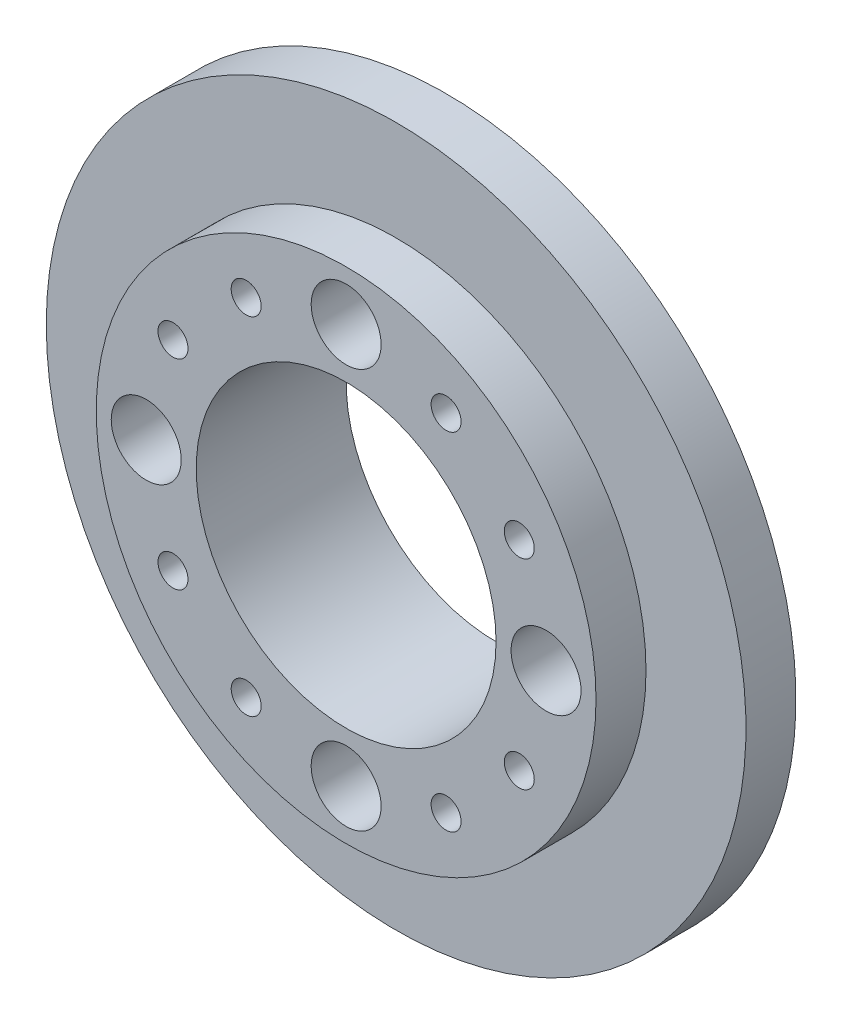
ISO-10303-21;
HEADER;
FILE_DESCRIPTION(('STEP AP214'),'2;1');
FILE_NAME('part.step','',(''),(''),'','','');
FILE_SCHEMA(('AUTOMOTIVE_DESIGN { 1 0 10303 214 1 1 1 1 }'));
ENDSEC;
DATA;
#1=APPLICATION_CONTEXT('core data for automotive mechanical design processes');
#2=APPLICATION_PROTOCOL_DEFINITION('international standard','automotive_design',2000,#1);
#3=PRODUCT_CONTEXT('',#1,'mechanical');
#4=PRODUCT('Part','Part','',(#3));
#5=PRODUCT_RELATED_PRODUCT_CATEGORY('part','',(#4));
#6=PRODUCT_DEFINITION_FORMATION('','',#4);
#7=PRODUCT_DEFINITION_CONTEXT('part definition',#1,'design');
#8=PRODUCT_DEFINITION('design','',#6,#7);
#9=PRODUCT_DEFINITION_SHAPE('','',#8);
#10=(LENGTH_UNIT() NAMED_UNIT(*) SI_UNIT(.MILLI.,.METRE.));
#11=(NAMED_UNIT(*) PLANE_ANGLE_UNIT() SI_UNIT($,.RADIAN.));
#12=(NAMED_UNIT(*) SI_UNIT($,.STERADIAN.) SOLID_ANGLE_UNIT());
#13=UNCERTAINTY_MEASURE_WITH_UNIT(LENGTH_MEASURE(1.E-05),#10,'distance_accuracy_value','');
#14=(GEOMETRIC_REPRESENTATION_CONTEXT(3) GLOBAL_UNCERTAINTY_ASSIGNED_CONTEXT((#13)) GLOBAL_UNIT_ASSIGNED_CONTEXT((#10,
#11,#12)) REPRESENTATION_CONTEXT('',''));
#15=CARTESIAN_POINT('',(0.,0.,0.));
#16=DIRECTION('',(0.,0.,1.));
#17=DIRECTION('',(1.,0.,0.));
#18=AXIS2_PLACEMENT_3D('',#15,#16,#17);
#19=CARTESIAN_POINT('',(0.,0.,2.5));
#20=DIRECTION('',(0.,0.,-1.));
#21=DIRECTION('',(-1.,0.,0.));
#22=AXIS2_PLACEMENT_3D('',#19,#20,#21);
#23=CYLINDRICAL_SURFACE('',#22,12.5);
#24=CARTESIAN_POINT('',(0.,0.,2.5));
#25=DIRECTION('',(0.,0.,1.));
#26=DIRECTION('',(1.,0.,0.));
#27=AXIS2_PLACEMENT_3D('',#24,#25,#26);
#28=CIRCLE('',#27,12.5);
#29=CARTESIAN_POINT('',(12.5,0.,2.5));
#30=VERTEX_POINT('',#29);
#31=EDGE_CURVE('E44',#30,#30,#28,.T.);
#32=ORIENTED_EDGE('',*,*,#31,.F.);
#33=EDGE_LOOP('',(#32));
#34=FACE_BOUND('',#33,.T.);
#35=CARTESIAN_POINT('',(0.,0.,0.));
#36=DIRECTION('',(0.,0.,1.));
#37=DIRECTION('',(1.,0.,0.));
#38=AXIS2_PLACEMENT_3D('',#35,#36,#37);
#39=CIRCLE('',#38,12.5);
#40=CARTESIAN_POINT('',(12.5,0.,0.));
#41=VERTEX_POINT('',#40);
#42=EDGE_CURVE('E39',#41,#41,#39,.T.);
#43=ORIENTED_EDGE('',*,*,#42,.T.);
#44=EDGE_LOOP('',(#43));
#45=FACE_BOUND('',#44,.T.);
#46=ADVANCED_FACE('F36',(#34,#45),#23,.T.);
#47=CARTESIAN_POINT('',(0.,0.,2.5));
#48=DIRECTION('',(0.,0.,1.));
#49=DIRECTION('',(1.,0.,0.));
#50=AXIS2_PLACEMENT_3D('',#47,#48,#49);
#51=PLANE('',#50);
#52=CARTESIAN_POINT('',(0.,10.,2.5));
#53=DIRECTION('',(0.,0.,1.));
#54=DIRECTION('',(1.,0.,0.));
#55=AXIS2_PLACEMENT_3D('',#52,#53,#54);
#56=CIRCLE('',#55,1.75);
#57=CARTESIAN_POINT('',(1.75,10.,2.5));
#58=VERTEX_POINT('',#57);
#59=EDGE_CURVE('E135',#58,#58,#56,.T.);
#60=ORIENTED_EDGE('',*,*,#59,.F.);
#61=EDGE_LOOP('',(#60));
#62=FACE_BOUND('',#61,.T.);
#63=CARTESIAN_POINT('',(-10.0000000000003,2.82380124105319E-13,2.5));
#64=DIRECTION('',(0.,0.,1.));
#65=DIRECTION('',(1.,0.,0.));
#66=AXIS2_PLACEMENT_3D('',#63,#64,#65);
#67=CIRCLE('',#66,1.75000000000022);
#68=CARTESIAN_POINT('',(-8.25000000000006,2.82380124105319E-13,2.5));
#69=VERTEX_POINT('',#68);
#70=EDGE_CURVE('E145',#69,#69,#67,.T.);
#71=ORIENTED_EDGE('',*,*,#70,.F.);
#72=EDGE_LOOP('',(#71));
#73=FACE_BOUND('',#72,.T.);
#74=CARTESIAN_POINT('',(-5.64760248210638E-13,-10.,2.5));
#75=DIRECTION('',(0.,0.,1.));
#76=DIRECTION('',(1.,0.,0.));
#77=AXIS2_PLACEMENT_3D('',#74,#75,#76);
#78=CIRCLE('',#77,1.75000000000061);
#79=CARTESIAN_POINT('',(1.75000000000004,-10.,2.5));
#80=VERTEX_POINT('',#79);
#81=EDGE_CURVE('E149',#80,#80,#78,.T.);
#82=ORIENTED_EDGE('',*,*,#81,.F.);
#83=EDGE_LOOP('',(#82));
#84=FACE_BOUND('',#83,.T.);
#85=CARTESIAN_POINT('',(9.99999999999972,-2.83604770904466E-13,2.5));
#86=DIRECTION('',(0.,0.,1.));
#87=DIRECTION('',(1.,0.,0.));
#88=AXIS2_PLACEMENT_3D('',#85,#86,#87);
#89=CIRCLE('',#88,1.75000000000045);
#90=CARTESIAN_POINT('',(11.7500000000002,-2.83604770904466E-13,2.5));
#91=VERTEX_POINT('',#90);
#92=EDGE_CURVE('E153',#91,#91,#89,.T.);
#93=ORIENTED_EDGE('',*,*,#92,.F.);
#94=EDGE_LOOP('',(#93));
#95=FACE_BOUND('',#94,.T.);
#96=CARTESIAN_POINT('',(-5.00000000000007,-8.66025403784435,2.5));
#97=DIRECTION('',(0.,0.,1.));
#98=DIRECTION('',(1.,0.,0.));
#99=AXIS2_PLACEMENT_3D('',#96,#97,#98);
#100=CIRCLE('',#99,0.75);
#101=CARTESIAN_POINT('',(-4.25000000000007,-8.66025403784435,2.5));
#102=VERTEX_POINT('',#101);
#103=EDGE_CURVE('E65',#102,#102,#100,.T.);
#104=ORIENTED_EDGE('',*,*,#103,.F.);
#105=EDGE_LOOP('',(#104));
#106=FACE_BOUND('',#105,.T.);
#107=CARTESIAN_POINT('',(4.99999999999995,-8.66025403784442,2.5));
#108=DIRECTION('',(0.,0.,1.));
#109=DIRECTION('',(1.,0.,0.));
#110=AXIS2_PLACEMENT_3D('',#107,#108,#109);
#111=CIRCLE('',#110,0.75);
#112=CARTESIAN_POINT('',(5.74999999999995,-8.66025403784442,2.5));
#113=VERTEX_POINT('',#112);
#114=EDGE_CURVE('E70',#113,#113,#111,.T.);
#115=ORIENTED_EDGE('',*,*,#114,.F.);
#116=EDGE_LOOP('',(#115));
#117=FACE_BOUND('',#116,.T.);
#118=CARTESIAN_POINT('',(8.66025403784437,-5.00000000000004,2.5));
#119=DIRECTION('',(0.,0.,1.));
#120=DIRECTION('',(1.,0.,0.));
#121=AXIS2_PLACEMENT_3D('',#118,#119,#120);
#122=CIRCLE('',#121,0.75);
#123=CARTESIAN_POINT('',(9.41025403784437,-5.00000000000004,2.5));
#124=VERTEX_POINT('',#123);
#125=EDGE_CURVE('E75',#124,#124,#122,.T.);
#126=ORIENTED_EDGE('',*,*,#125,.F.);
#127=EDGE_LOOP('',(#126));
#128=FACE_BOUND('',#127,.T.);
#129=CARTESIAN_POINT('',(8.6602540378444,4.99999999999998,2.5));
#130=DIRECTION('',(0.,0.,1.));
#131=DIRECTION('',(1.,0.,0.));
#132=AXIS2_PLACEMENT_3D('',#129,#130,#131);
#133=CIRCLE('',#132,0.75);
#134=CARTESIAN_POINT('',(9.4102540378444,4.99999999999998,2.5));
#135=VERTEX_POINT('',#134);
#136=EDGE_CURVE('E81',#135,#135,#133,.T.);
#137=ORIENTED_EDGE('',*,*,#136,.F.);
#138=EDGE_LOOP('',(#137));
#139=FACE_BOUND('',#138,.T.);
#140=CARTESIAN_POINT('',(5.00000000000001,8.66025403784438,2.5));
#141=DIRECTION('',(0.,0.,1.));
#142=DIRECTION('',(1.,0.,0.));
#143=AXIS2_PLACEMENT_3D('',#140,#141,#142);
#144=CIRCLE('',#143,0.75);
#145=CARTESIAN_POINT('',(5.75000000000001,8.66025403784438,2.5));
#146=VERTEX_POINT('',#145);
#147=EDGE_CURVE('E85',#146,#146,#144,.T.);
#148=ORIENTED_EDGE('',*,*,#147,.F.);
#149=EDGE_LOOP('',(#148));
#150=FACE_BOUND('',#149,.T.);
#151=CARTESIAN_POINT('',(0.,0.,2.5));
#152=DIRECTION('',(0.,0.,1.));
#153=DIRECTION('',(1.,0.,0.));
#154=AXIS2_PLACEMENT_3D('',#151,#152,#153);
#155=CIRCLE('',#154,7.5);
#156=CARTESIAN_POINT('',(7.5,0.,2.5));
#157=VERTEX_POINT('',#156);
#158=EDGE_CURVE('E89',#157,#157,#155,.T.);
#159=ORIENTED_EDGE('',*,*,#158,.F.);
#160=EDGE_LOOP('',(#159));
#161=FACE_BOUND('',#160,.T.);
#162=CARTESIAN_POINT('',(-8.66025403784443,-4.99999999999992,2.5));
#163=DIRECTION('',(0.,0.,1.));
#164=DIRECTION('',(1.,0.,0.));
#165=AXIS2_PLACEMENT_3D('',#162,#163,#164);
#166=CIRCLE('',#165,0.75);
#167=CARTESIAN_POINT('',(-7.91025403784443,-4.99999999999992,2.5));
#168=VERTEX_POINT('',#167);
#169=EDGE_CURVE('E93',#168,#168,#166,.T.);
#170=ORIENTED_EDGE('',*,*,#169,.F.);
#171=EDGE_LOOP('',(#170));
#172=FACE_BOUND('',#171,.T.);
#173=CARTESIAN_POINT('',(-8.66025403784433,5.0000000000001,2.5));
#174=DIRECTION('',(0.,0.,1.));
#175=DIRECTION('',(1.,0.,0.));
#176=AXIS2_PLACEMENT_3D('',#173,#174,#175);
#177=CIRCLE('',#176,0.750000000000001);
#178=CARTESIAN_POINT('',(-7.91025403784433,5.0000000000001,2.5));
#179=VERTEX_POINT('',#178);
#180=EDGE_CURVE('E97',#179,#179,#177,.T.);
#181=ORIENTED_EDGE('',*,*,#180,.F.);
#182=EDGE_LOOP('',(#181));
#183=FACE_BOUND('',#182,.T.);
#184=CARTESIAN_POINT('',(-4.99999999999989,8.66025403784445,2.5));
#185=DIRECTION('',(0.,0.,1.));
#186=DIRECTION('',(1.,0.,0.));
#187=AXIS2_PLACEMENT_3D('',#184,#185,#186);
#188=CIRCLE('',#187,0.749999999999999);
#189=CARTESIAN_POINT('',(-4.24999999999989,8.66025403784445,2.5));
#190=VERTEX_POINT('',#189);
#191=EDGE_CURVE('E101',#190,#190,#188,.T.);
#192=ORIENTED_EDGE('',*,*,#191,.F.);
#193=EDGE_LOOP('',(#192));
#194=FACE_BOUND('',#193,.T.);
#195=ORIENTED_EDGE('',*,*,#31,.T.);
#196=EDGE_LOOP('',(#195));
#197=FACE_BOUND('',#196,.T.);
#198=ADVANCED_FACE('F218',(#62,#73,#84,#95,#106,#117,#128,#139,#150,#161,#172,#183,#194,#197),
#51,.T.);
#199=CARTESIAN_POINT('',(0.,0.,-2.5));
#200=DIRECTION('',(0.,0.,1.));
#201=DIRECTION('',(1.,0.,0.));
#202=AXIS2_PLACEMENT_3D('',#199,#200,#201);
#203=CYLINDRICAL_SURFACE('',#202,17.5);
#204=CARTESIAN_POINT('',(0.,0.,-2.5));
#205=DIRECTION('',(0.,0.,-1.));
#206=DIRECTION('',(-1.,0.,0.));
#207=AXIS2_PLACEMENT_3D('',#204,#205,#206);
#208=CIRCLE('',#207,17.5);
#209=CARTESIAN_POINT('',(-17.5,0.,-2.5));
#210=VERTEX_POINT('',#209);
#211=EDGE_CURVE('E54',#210,#210,#208,.T.);
#212=ORIENTED_EDGE('',*,*,#211,.F.);
#213=EDGE_LOOP('',(#212));
#214=FACE_BOUND('',#213,.T.);
#215=CARTESIAN_POINT('',(0.,0.,0.));
#216=DIRECTION('',(0.,0.,-1.));
#217=DIRECTION('',(-1.,0.,0.));
#218=AXIS2_PLACEMENT_3D('',#215,#216,#217);
#219=CIRCLE('',#218,17.5);
#220=CARTESIAN_POINT('',(-17.5,0.,0.));
#221=VERTEX_POINT('',#220);
#222=EDGE_CURVE('E58',#221,#221,#219,.T.);
#223=ORIENTED_EDGE('',*,*,#222,.T.);
#224=EDGE_LOOP('',(#223));
#225=FACE_BOUND('',#224,.T.);
#226=ADVANCED_FACE('F223',(#214,#225),#203,.T.);
#227=CARTESIAN_POINT('',(0.,0.,-2.5));
#228=DIRECTION('',(0.,0.,-1.));
#229=DIRECTION('',(-1.,0.,0.));
#230=AXIS2_PLACEMENT_3D('',#227,#228,#229);
#231=PLANE('',#230);
#232=CARTESIAN_POINT('',(0.,0.,-2.5));
#233=DIRECTION('',(0.,0.,-1.));
#234=DIRECTION('',(-1.,0.,0.));
#235=AXIS2_PLACEMENT_3D('',#232,#233,#234);
#236=CIRCLE('',#235,12.5);
#237=CARTESIAN_POINT('',(-12.5,0.,-2.5));
#238=VERTEX_POINT('',#237);
#239=EDGE_CURVE('E10',#238,#238,#236,.T.);
#240=ORIENTED_EDGE('',*,*,#239,.F.);
#241=EDGE_LOOP('',(#240));
#242=FACE_BOUND('',#241,.T.);
#243=ORIENTED_EDGE('',*,*,#211,.T.);
#244=EDGE_LOOP('',(#243));
#245=FACE_BOUND('',#244,.T.);
#246=ADVANCED_FACE('F234',(#242,#245),#231,.T.);
#247=CARTESIAN_POINT('',(0.,0.,0.));
#248=DIRECTION('',(0.,0.,-1.));
#249=DIRECTION('',(-1.,0.,0.));
#250=AXIS2_PLACEMENT_3D('',#247,#248,#249);
#251=PLANE('',#250);
#252=ORIENTED_EDGE('',*,*,#42,.F.);
#253=EDGE_LOOP('',(#252));
#254=FACE_BOUND('',#253,.T.);
#255=ORIENTED_EDGE('',*,*,#222,.F.);
#256=EDGE_LOOP('',(#255));
#257=FACE_BOUND('',#256,.T.);
#258=ADVANCED_FACE('F231',(#254,#257),#251,.F.);
#259=CARTESIAN_POINT('',(0.,0.,-5.));
#260=DIRECTION('',(0.,0.,1.));
#261=DIRECTION('',(1.,0.,0.));
#262=AXIS2_PLACEMENT_3D('',#259,#260,#261);
#263=CYLINDRICAL_SURFACE('',#262,12.5);
#264=CARTESIAN_POINT('',(0.,0.,-5.));
#265=DIRECTION('',(0.,0.,-1.));
#266=DIRECTION('',(-1.,0.,0.));
#267=AXIS2_PLACEMENT_3D('',#264,#265,#266);
#268=CIRCLE('',#267,12.5);
#269=CARTESIAN_POINT('',(-12.5,0.,-5.));
#270=VERTEX_POINT('',#269);
#271=EDGE_CURVE('E52',#270,#270,#268,.T.);
#272=ORIENTED_EDGE('',*,*,#271,.F.);
#273=EDGE_LOOP('',(#272));
#274=FACE_BOUND('',#273,.T.);
#275=ORIENTED_EDGE('',*,*,#239,.T.);
#276=EDGE_LOOP('',(#275));
#277=FACE_BOUND('',#276,.T.);
#278=ADVANCED_FACE('F180',(#274,#277),#263,.T.);
#279=CARTESIAN_POINT('',(0.,0.,-5.));
#280=DIRECTION('',(0.,0.,-1.));
#281=DIRECTION('',(-1.,0.,0.));
#282=AXIS2_PLACEMENT_3D('',#279,#280,#281);
#283=PLANE('',#282);
#284=CARTESIAN_POINT('',(0.,10.,-5.));
#285=DIRECTION('',(0.,0.,-1.));
#286=DIRECTION('',(-1.,0.,0.));
#287=AXIS2_PLACEMENT_3D('',#284,#285,#286);
#288=CIRCLE('',#287,1.75);
#289=CARTESIAN_POINT('',(-1.75,10.,-5.));
#290=VERTEX_POINT('',#289);
#291=EDGE_CURVE('E157',#290,#290,#288,.T.);
#292=ORIENTED_EDGE('',*,*,#291,.F.);
#293=EDGE_LOOP('',(#292));
#294=FACE_BOUND('',#293,.T.);
#295=CARTESIAN_POINT('',(-10.0000000000003,2.82380124105319E-13,-5.));
#296=DIRECTION('',(0.,0.,-1.));
#297=DIRECTION('',(-1.,0.,0.));
#298=AXIS2_PLACEMENT_3D('',#295,#296,#297);
#299=CIRCLE('',#298,1.75000000000022);
#300=CARTESIAN_POINT('',(-11.7500000000005,2.82380124105319E-13,-5.));
#301=VERTEX_POINT('',#300);
#302=EDGE_CURVE('E166',#301,#301,#299,.T.);
#303=ORIENTED_EDGE('',*,*,#302,.F.);
#304=EDGE_LOOP('',(#303));
#305=FACE_BOUND('',#304,.T.);
#306=CARTESIAN_POINT('',(-5.64760248210638E-13,-10.,-5.));
#307=DIRECTION('',(0.,0.,-1.));
#308=DIRECTION('',(-1.,0.,0.));
#309=AXIS2_PLACEMENT_3D('',#306,#307,#308);
#310=CIRCLE('',#309,1.75000000000061);
#311=CARTESIAN_POINT('',(-1.75000000000117,-10.,-5.));
#312=VERTEX_POINT('',#311);
#313=EDGE_CURVE('E162',#312,#312,#310,.T.);
#314=ORIENTED_EDGE('',*,*,#313,.F.);
#315=EDGE_LOOP('',(#314));
#316=FACE_BOUND('',#315,.T.);
#317=CARTESIAN_POINT('',(9.99999999999972,-2.83604770904466E-13,-5.));
#318=DIRECTION('',(0.,0.,-1.));
#319=DIRECTION('',(-1.,0.,0.));
#320=AXIS2_PLACEMENT_3D('',#317,#318,#319);
#321=CIRCLE('',#320,1.75000000000045);
#322=CARTESIAN_POINT('',(8.24999999999927,-2.83604770904466E-13,-5.));
#323=VERTEX_POINT('',#322);
#324=EDGE_CURVE('E158',#323,#323,#321,.T.);
#325=ORIENTED_EDGE('',*,*,#324,.F.);
#326=EDGE_LOOP('',(#325));
#327=FACE_BOUND('',#326,.T.);
#328=CARTESIAN_POINT('',(-5.00000000000007,-8.66025403784435,-5.));
#329=DIRECTION('',(0.,0.,1.));
#330=DIRECTION('',(1.,0.,0.));
#331=AXIS2_PLACEMENT_3D('',#328,#329,#330);
#332=CIRCLE('',#331,0.75);
#333=CARTESIAN_POINT('',(-4.25000000000007,-8.66025403784435,-5.));
#334=VERTEX_POINT('',#333);
#335=EDGE_CURVE('E118',#334,#334,#332,.T.);
#336=ORIENTED_EDGE('',*,*,#335,.T.);
#337=EDGE_LOOP('',(#336));
#338=FACE_BOUND('',#337,.T.);
#339=CARTESIAN_POINT('',(4.99999999999995,-8.66025403784442,-5.));
#340=DIRECTION('',(0.,0.,1.));
#341=DIRECTION('',(1.,0.,0.));
#342=AXIS2_PLACEMENT_3D('',#339,#340,#341);
#343=CIRCLE('',#342,0.75);
#344=CARTESIAN_POINT('',(5.74999999999995,-8.66025403784442,-5.));
#345=VERTEX_POINT('',#344);
#346=EDGE_CURVE('E122',#345,#345,#343,.T.);
#347=ORIENTED_EDGE('',*,*,#346,.T.);
#348=EDGE_LOOP('',(#347));
#349=FACE_BOUND('',#348,.T.);
#350=CARTESIAN_POINT('',(8.66025403784437,-5.00000000000004,-5.));
#351=DIRECTION('',(0.,0.,1.));
#352=DIRECTION('',(1.,0.,0.));
#353=AXIS2_PLACEMENT_3D('',#350,#351,#352);
#354=CIRCLE('',#353,0.75);
#355=CARTESIAN_POINT('',(9.41025403784437,-5.00000000000004,-5.));
#356=VERTEX_POINT('',#355);
#357=EDGE_CURVE('E111',#356,#356,#354,.T.);
#358=ORIENTED_EDGE('',*,*,#357,.T.);
#359=EDGE_LOOP('',(#358));
#360=FACE_BOUND('',#359,.T.);
#361=CARTESIAN_POINT('',(8.6602540378444,4.99999999999998,-5.));
#362=DIRECTION('',(0.,0.,1.));
#363=DIRECTION('',(1.,0.,0.));
#364=AXIS2_PLACEMENT_3D('',#361,#362,#363);
#365=CIRCLE('',#364,0.75);
#366=CARTESIAN_POINT('',(9.4102540378444,4.99999999999998,-5.));
#367=VERTEX_POINT('',#366);
#368=EDGE_CURVE('E106',#367,#367,#365,.T.);
#369=ORIENTED_EDGE('',*,*,#368,.T.);
#370=EDGE_LOOP('',(#369));
#371=FACE_BOUND('',#370,.T.);
#372=CARTESIAN_POINT('',(5.00000000000001,8.66025403784438,-5.));
#373=DIRECTION('',(0.,0.,1.));
#374=DIRECTION('',(1.,0.,0.));
#375=AXIS2_PLACEMENT_3D('',#372,#373,#374);
#376=CIRCLE('',#375,0.75);
#377=CARTESIAN_POINT('',(5.75000000000001,8.66025403784438,-5.));
#378=VERTEX_POINT('',#377);
#379=EDGE_CURVE('E110',#378,#378,#376,.T.);
#380=ORIENTED_EDGE('',*,*,#379,.T.);
#381=EDGE_LOOP('',(#380));
#382=FACE_BOUND('',#381,.T.);
#383=CARTESIAN_POINT('',(0.,0.,-5.));
#384=DIRECTION('',(0.,0.,1.));
#385=DIRECTION('',(1.,0.,0.));
#386=AXIS2_PLACEMENT_3D('',#383,#384,#385);
#387=CIRCLE('',#386,7.5);
#388=CARTESIAN_POINT('',(7.5,0.,-5.));
#389=VERTEX_POINT('',#388);
#390=EDGE_CURVE('E105',#389,#389,#387,.T.);
#391=ORIENTED_EDGE('',*,*,#390,.T.);
#392=EDGE_LOOP('',(#391));
#393=FACE_BOUND('',#392,.T.);
#394=CARTESIAN_POINT('',(-8.66025403784443,-4.99999999999992,-5.));
#395=DIRECTION('',(0.,0.,1.));
#396=DIRECTION('',(1.,0.,0.));
#397=AXIS2_PLACEMENT_3D('',#394,#395,#396);
#398=CIRCLE('',#397,0.75);
#399=CARTESIAN_POINT('',(-7.91025403784443,-4.99999999999992,-5.));
#400=VERTEX_POINT('',#399);
#401=EDGE_CURVE('E123',#400,#400,#398,.T.);
#402=ORIENTED_EDGE('',*,*,#401,.T.);
#403=EDGE_LOOP('',(#402));
#404=FACE_BOUND('',#403,.T.);
#405=CARTESIAN_POINT('',(-8.66025403784433,5.0000000000001,-5.));
#406=DIRECTION('',(0.,0.,1.));
#407=DIRECTION('',(1.,0.,0.));
#408=AXIS2_PLACEMENT_3D('',#405,#406,#407);
#409=CIRCLE('',#408,0.750000000000001);
#410=CARTESIAN_POINT('',(-7.91025403784433,5.0000000000001,-5.));
#411=VERTEX_POINT('',#410);
#412=EDGE_CURVE('E134',#411,#411,#409,.T.);
#413=ORIENTED_EDGE('',*,*,#412,.T.);
#414=EDGE_LOOP('',(#413));
#415=FACE_BOUND('',#414,.T.);
#416=CARTESIAN_POINT('',(-4.99999999999989,8.66025403784445,-5.));
#417=DIRECTION('',(0.,0.,1.));
#418=DIRECTION('',(1.,0.,0.));
#419=AXIS2_PLACEMENT_3D('',#416,#417,#418);
#420=CIRCLE('',#419,0.749999999999999);
#421=CARTESIAN_POINT('',(-4.24999999999989,8.66025403784445,-5.));
#422=VERTEX_POINT('',#421);
#423=EDGE_CURVE('E130',#422,#422,#420,.T.);
#424=ORIENTED_EDGE('',*,*,#423,.T.);
#425=EDGE_LOOP('',(#424));
#426=FACE_BOUND('',#425,.T.);
#427=ORIENTED_EDGE('',*,*,#271,.T.);
#428=EDGE_LOOP('',(#427));
#429=FACE_BOUND('',#428,.T.);
#430=ADVANCED_FACE('F176',(#294,#305,#316,#327,#338,#349,#360,#371,#382,#393,#404,#415,#426,
#429),#283,.T.);
#431=CARTESIAN_POINT('',(-4.99999999999989,8.66025403784445,-5.));
#432=DIRECTION('',(0.,0.,1.));
#433=DIRECTION('',(1.,0.,0.));
#434=AXIS2_PLACEMENT_3D('',#431,#432,#433);
#435=CYLINDRICAL_SURFACE('',#434,0.749999999999999);
#436=ORIENTED_EDGE('',*,*,#191,.T.);
#437=EDGE_LOOP('',(#436));
#438=FACE_BOUND('',#437,.T.);
#439=ORIENTED_EDGE('',*,*,#423,.F.);
#440=EDGE_LOOP('',(#439));
#441=FACE_BOUND('',#440,.T.);
#442=ADVANCED_FACE('F179',(#438,#441),#435,.F.);
#443=CARTESIAN_POINT('',(-8.66025403784433,5.0000000000001,-5.));
#444=DIRECTION('',(0.,0.,1.));
#445=DIRECTION('',(1.,0.,0.));
#446=AXIS2_PLACEMENT_3D('',#443,#444,#445);
#447=CYLINDRICAL_SURFACE('',#446,0.750000000000001);
#448=ORIENTED_EDGE('',*,*,#180,.T.);
#449=EDGE_LOOP('',(#448));
#450=FACE_BOUND('',#449,.T.);
#451=ORIENTED_EDGE('',*,*,#412,.F.);
#452=EDGE_LOOP('',(#451));
#453=FACE_BOUND('',#452,.T.);
#454=ADVANCED_FACE('F207',(#450,#453),#447,.F.);
#455=CARTESIAN_POINT('',(-8.66025403784443,-4.99999999999992,-5.));
#456=DIRECTION('',(0.,0.,1.));
#457=DIRECTION('',(1.,0.,0.));
#458=AXIS2_PLACEMENT_3D('',#455,#456,#457);
#459=CYLINDRICAL_SURFACE('',#458,0.75);
#460=ORIENTED_EDGE('',*,*,#169,.T.);
#461=EDGE_LOOP('',(#460));
#462=FACE_BOUND('',#461,.T.);
#463=ORIENTED_EDGE('',*,*,#401,.F.);
#464=EDGE_LOOP('',(#463));
#465=FACE_BOUND('',#464,.T.);
#466=ADVANCED_FACE('F213',(#462,#465),#459,.F.);
#467=CARTESIAN_POINT('',(0.,0.,-5.));
#468=DIRECTION('',(0.,0.,1.));
#469=DIRECTION('',(1.,0.,0.));
#470=AXIS2_PLACEMENT_3D('',#467,#468,#469);
#471=CYLINDRICAL_SURFACE('',#470,7.5);
#472=ORIENTED_EDGE('',*,*,#158,.T.);
#473=EDGE_LOOP('',(#472));
#474=FACE_BOUND('',#473,.T.);
#475=ORIENTED_EDGE('',*,*,#390,.F.);
#476=EDGE_LOOP('',(#475));
#477=FACE_BOUND('',#476,.T.);
#478=ADVANCED_FACE('F285',(#474,#477),#471,.F.);
#479=CARTESIAN_POINT('',(5.00000000000001,8.66025403784438,-5.));
#480=DIRECTION('',(0.,0.,1.));
#481=DIRECTION('',(1.,0.,0.));
#482=AXIS2_PLACEMENT_3D('',#479,#480,#481);
#483=CYLINDRICAL_SURFACE('',#482,0.75);
#484=ORIENTED_EDGE('',*,*,#147,.T.);
#485=EDGE_LOOP('',(#484));
#486=FACE_BOUND('',#485,.T.);
#487=ORIENTED_EDGE('',*,*,#379,.F.);
#488=EDGE_LOOP('',(#487));
#489=FACE_BOUND('',#488,.T.);
#490=ADVANCED_FACE('F295',(#486,#489),#483,.F.);
#491=CARTESIAN_POINT('',(8.6602540378444,4.99999999999998,-5.));
#492=DIRECTION('',(0.,0.,1.));
#493=DIRECTION('',(1.,0.,0.));
#494=AXIS2_PLACEMENT_3D('',#491,#492,#493);
#495=CYLINDRICAL_SURFACE('',#494,0.75);
#496=ORIENTED_EDGE('',*,*,#136,.T.);
#497=EDGE_LOOP('',(#496));
#498=FACE_BOUND('',#497,.T.);
#499=ORIENTED_EDGE('',*,*,#368,.F.);
#500=EDGE_LOOP('',(#499));
#501=FACE_BOUND('',#500,.T.);
#502=ADVANCED_FACE('F305',(#498,#501),#495,.F.);
#503=CARTESIAN_POINT('',(8.66025403784437,-5.00000000000004,-5.));
#504=DIRECTION('',(0.,0.,1.));
#505=DIRECTION('',(1.,0.,0.));
#506=AXIS2_PLACEMENT_3D('',#503,#504,#505);
#507=CYLINDRICAL_SURFACE('',#506,0.75);
#508=ORIENTED_EDGE('',*,*,#125,.T.);
#509=EDGE_LOOP('',(#508));
#510=FACE_BOUND('',#509,.T.);
#511=ORIENTED_EDGE('',*,*,#357,.F.);
#512=EDGE_LOOP('',(#511));
#513=FACE_BOUND('',#512,.T.);
#514=ADVANCED_FACE('F315',(#510,#513),#507,.F.);
#515=CARTESIAN_POINT('',(4.99999999999995,-8.66025403784442,-5.));
#516=DIRECTION('',(0.,0.,1.));
#517=DIRECTION('',(1.,0.,0.));
#518=AXIS2_PLACEMENT_3D('',#515,#516,#517);
#519=CYLINDRICAL_SURFACE('',#518,0.75);
#520=ORIENTED_EDGE('',*,*,#114,.T.);
#521=EDGE_LOOP('',(#520));
#522=FACE_BOUND('',#521,.T.);
#523=ORIENTED_EDGE('',*,*,#346,.F.);
#524=EDGE_LOOP('',(#523));
#525=FACE_BOUND('',#524,.T.);
#526=ADVANCED_FACE('F325',(#522,#525),#519,.F.);
#527=CARTESIAN_POINT('',(-5.00000000000007,-8.66025403784435,-5.));
#528=DIRECTION('',(0.,0.,1.));
#529=DIRECTION('',(1.,0.,0.));
#530=AXIS2_PLACEMENT_3D('',#527,#528,#529);
#531=CYLINDRICAL_SURFACE('',#530,0.75);
#532=ORIENTED_EDGE('',*,*,#103,.T.);
#533=EDGE_LOOP('',(#532));
#534=FACE_BOUND('',#533,.T.);
#535=ORIENTED_EDGE('',*,*,#335,.F.);
#536=EDGE_LOOP('',(#535));
#537=FACE_BOUND('',#536,.T.);
#538=ADVANCED_FACE('F334',(#534,#537),#531,.F.);
#539=CARTESIAN_POINT('',(9.99999999999972,-2.83604770904466E-13,5.));
#540=DIRECTION('',(0.,0.,-1.));
#541=DIRECTION('',(-1.,0.,0.));
#542=AXIS2_PLACEMENT_3D('',#539,#540,#541);
#543=CYLINDRICAL_SURFACE('',#542,1.75000000000045);
#544=ORIENTED_EDGE('',*,*,#92,.T.);
#545=EDGE_LOOP('',(#544));
#546=FACE_BOUND('',#545,.T.);
#547=ORIENTED_EDGE('',*,*,#324,.T.);
#548=EDGE_LOOP('',(#547));
#549=FACE_BOUND('',#548,.T.);
#550=ADVANCED_FACE('F343',(#546,#549),#543,.F.);
#551=CARTESIAN_POINT('',(-5.64760248210638E-13,-10.,5.));
#552=DIRECTION('',(0.,0.,-1.));
#553=DIRECTION('',(-1.,0.,0.));
#554=AXIS2_PLACEMENT_3D('',#551,#552,#553);
#555=CYLINDRICAL_SURFACE('',#554,1.75000000000061);
#556=ORIENTED_EDGE('',*,*,#81,.T.);
#557=EDGE_LOOP('',(#556));
#558=FACE_BOUND('',#557,.T.);
#559=ORIENTED_EDGE('',*,*,#313,.T.);
#560=EDGE_LOOP('',(#559));
#561=FACE_BOUND('',#560,.T.);
#562=ADVANCED_FACE('F363',(#558,#561),#555,.F.);
#563=CARTESIAN_POINT('',(-10.0000000000003,2.82380124105319E-13,5.));
#564=DIRECTION('',(0.,0.,-1.));
#565=DIRECTION('',(-1.,0.,0.));
#566=AXIS2_PLACEMENT_3D('',#563,#564,#565);
#567=CYLINDRICAL_SURFACE('',#566,1.75000000000022);
#568=ORIENTED_EDGE('',*,*,#70,.T.);
#569=EDGE_LOOP('',(#568));
#570=FACE_BOUND('',#569,.T.);
#571=ORIENTED_EDGE('',*,*,#302,.T.);
#572=EDGE_LOOP('',(#571));
#573=FACE_BOUND('',#572,.T.);
#574=ADVANCED_FACE('F373',(#570,#573),#567,.F.);
#575=CARTESIAN_POINT('',(0.,10.,5.));
#576=DIRECTION('',(0.,0.,-1.));
#577=DIRECTION('',(-1.,0.,0.));
#578=AXIS2_PLACEMENT_3D('',#575,#576,#577);
#579=CYLINDRICAL_SURFACE('',#578,1.75);
#580=ORIENTED_EDGE('',*,*,#59,.T.);
#581=EDGE_LOOP('',(#580));
#582=FACE_BOUND('',#581,.T.);
#583=ORIENTED_EDGE('',*,*,#291,.T.);
#584=EDGE_LOOP('',(#583));
#585=FACE_BOUND('',#584,.T.);
#586=ADVANCED_FACE('F174',(#582,#585),#579,.F.);
#587=CLOSED_SHELL('',(#46,#198,#226,#246,#258,#278,#430,#442,#454,#466,#478,#490,#502,#514,#526,
#538,#550,#562,#574,#586));
#588=MANIFOLD_SOLID_BREP('B2',#587);
#589=ADVANCED_BREP_SHAPE_REPRESENTATION('',(#18,#588),#14);
#590=SHAPE_DEFINITION_REPRESENTATION(#9,#589);
ENDSEC;
END-ISO-10303-21;
